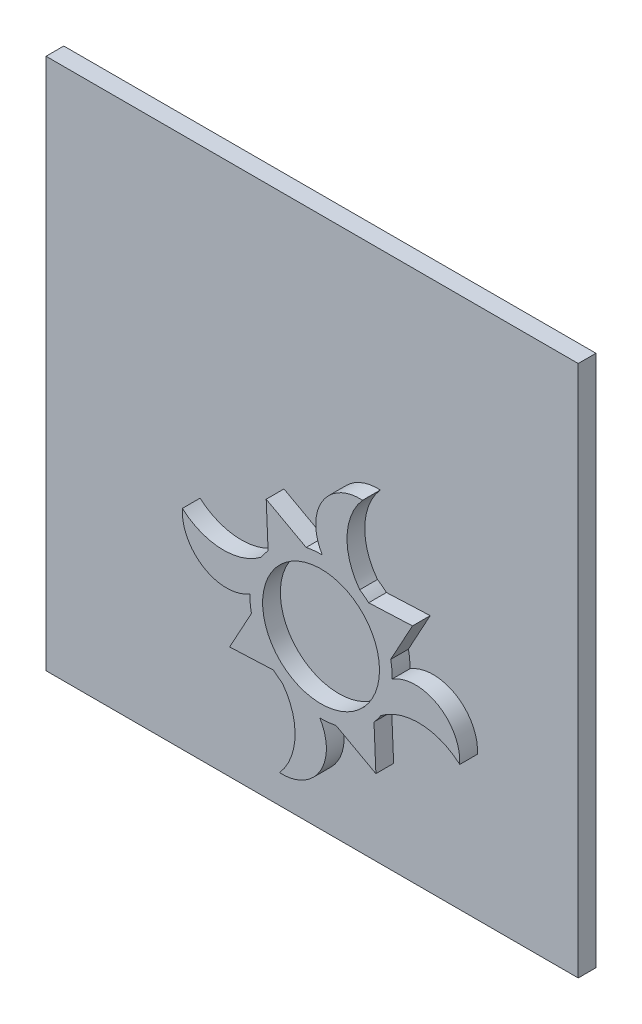
ISO-10303-21;
HEADER;
FILE_DESCRIPTION(('STEP AP214'),'2;1');
FILE_NAME('part.step','',(''),(''),'','','');
FILE_SCHEMA(('AUTOMOTIVE_DESIGN { 1 0 10303 214 1 1 1 1 }'));
ENDSEC;
DATA;
#1=APPLICATION_CONTEXT('core data for automotive mechanical design processes');
#2=APPLICATION_PROTOCOL_DEFINITION('international standard','automotive_design',2000,#1);
#3=PRODUCT_CONTEXT('',#1,'mechanical');
#4=PRODUCT('Part','Part','',(#3));
#5=PRODUCT_RELATED_PRODUCT_CATEGORY('part','',(#4));
#6=PRODUCT_DEFINITION_FORMATION('','',#4);
#7=PRODUCT_DEFINITION_CONTEXT('part definition',#1,'design');
#8=PRODUCT_DEFINITION('design','',#6,#7);
#9=PRODUCT_DEFINITION_SHAPE('','',#8);
#10=(LENGTH_UNIT() NAMED_UNIT(*) SI_UNIT(.MILLI.,.METRE.));
#11=(NAMED_UNIT(*) PLANE_ANGLE_UNIT() SI_UNIT($,.RADIAN.));
#12=(NAMED_UNIT(*) SI_UNIT($,.STERADIAN.) SOLID_ANGLE_UNIT());
#13=UNCERTAINTY_MEASURE_WITH_UNIT(LENGTH_MEASURE(1.E-05),#10,'distance_accuracy_value','');
#14=(GEOMETRIC_REPRESENTATION_CONTEXT(3) GLOBAL_UNCERTAINTY_ASSIGNED_CONTEXT((#13)) GLOBAL_UNIT_ASSIGNED_CONTEXT((#10,
#11,#12)) REPRESENTATION_CONTEXT('',''));
#15=CARTESIAN_POINT('',(0.,0.,0.));
#16=DIRECTION('',(0.,0.,1.));
#17=DIRECTION('',(1.,0.,0.));
#18=AXIS2_PLACEMENT_3D('',#15,#16,#17);
#19=CARTESIAN_POINT('',(0.,0.,10.));
#20=DIRECTION('',(1.,0.,0.));
#21=DIRECTION('',(0.,0.,-1.));
#22=AXIS2_PLACEMENT_3D('',#19,#20,#21);
#23=PLANE('',#22);
#24=DIRECTION('',(0.,-1.,0.));
#25=VECTOR('',#24,1.);
#26=CARTESIAN_POINT('',(0.,0.,0.));
#27=LINE('',#26,#25);
#28=CARTESIAN_POINT('',(0.,300.,0.));
#29=VERTEX_POINT('',#28);
#30=CARTESIAN_POINT('',(0.,0.,0.));
#31=VERTEX_POINT('',#30);
#32=EDGE_CURVE('E255',#29,#31,#27,.T.);
#33=ORIENTED_EDGE('',*,*,#32,.T.);
#34=DIRECTION('',(0.,0.,-1.));
#35=VECTOR('',#34,1.);
#36=CARTESIAN_POINT('',(0.,0.,10.));
#37=LINE('',#36,#35);
#38=CARTESIAN_POINT('',(0.,0.,10.));
#39=VERTEX_POINT('',#38);
#40=EDGE_CURVE('E11',#39,#31,#37,.T.);
#41=ORIENTED_EDGE('',*,*,#40,.F.);
#42=DIRECTION('',(0.,-1.,0.));
#43=VECTOR('',#42,1.);
#44=CARTESIAN_POINT('',(0.,0.,10.));
#45=LINE('',#44,#43);
#46=CARTESIAN_POINT('',(0.,300.,10.));
#47=VERTEX_POINT('',#46);
#48=EDGE_CURVE('E476',#47,#39,#45,.T.);
#49=ORIENTED_EDGE('',*,*,#48,.F.);
#50=DIRECTION('',(0.,0.,-1.));
#51=VECTOR('',#50,1.);
#52=CARTESIAN_POINT('',(0.,300.,10.));
#53=LINE('',#52,#51);
#54=EDGE_CURVE('E490',#47,#29,#53,.T.);
#55=ORIENTED_EDGE('',*,*,#54,.T.);
#56=EDGE_LOOP('',(#33,#41,#49,#55));
#57=FACE_BOUND('',#56,.T.);
#58=ADVANCED_FACE('F47',(#57),#23,.F.);
#59=CARTESIAN_POINT('',(0.,0.,10.));
#60=DIRECTION('',(0.,1.,0.));
#61=DIRECTION('',(0.,0.,1.));
#62=AXIS2_PLACEMENT_3D('',#59,#60,#61);
#63=PLANE('',#62);
#64=DIRECTION('',(1.,0.,0.));
#65=VECTOR('',#64,1.);
#66=CARTESIAN_POINT('',(0.,0.,0.));
#67=LINE('',#66,#65);
#68=CARTESIAN_POINT('',(300.,0.,0.));
#69=VERTEX_POINT('',#68);
#70=EDGE_CURVE('E494',#31,#69,#67,.T.);
#71=ORIENTED_EDGE('',*,*,#70,.T.);
#72=DIRECTION('',(0.,0.,-1.));
#73=VECTOR('',#72,1.);
#74=CARTESIAN_POINT('',(300.,0.,10.));
#75=LINE('',#74,#73);
#76=CARTESIAN_POINT('',(300.,0.,10.));
#77=VERTEX_POINT('',#76);
#78=EDGE_CURVE('E55',#77,#69,#75,.T.);
#79=ORIENTED_EDGE('',*,*,#78,.F.);
#80=DIRECTION('',(1.,0.,0.));
#81=VECTOR('',#80,1.);
#82=CARTESIAN_POINT('',(0.,0.,10.));
#83=LINE('',#82,#81);
#84=EDGE_CURVE('E480',#39,#77,#83,.T.);
#85=ORIENTED_EDGE('',*,*,#84,.F.);
#86=ORIENTED_EDGE('',*,*,#40,.T.);
#87=EDGE_LOOP('',(#71,#79,#85,#86));
#88=FACE_BOUND('',#87,.T.);
#89=ADVANCED_FACE('F532',(#88),#63,.F.);
#90=CARTESIAN_POINT('',(300.,0.,10.));
#91=DIRECTION('',(-1.,0.,0.));
#92=DIRECTION('',(0.,0.,1.));
#93=AXIS2_PLACEMENT_3D('',#90,#91,#92);
#94=PLANE('',#93);
#95=DIRECTION('',(0.,1.,0.));
#96=VECTOR('',#95,1.);
#97=CARTESIAN_POINT('',(300.,0.,0.));
#98=LINE('',#97,#96);
#99=CARTESIAN_POINT('',(300.,300.,0.));
#100=VERTEX_POINT('',#99);
#101=EDGE_CURVE('E497',#69,#100,#98,.T.);
#102=ORIENTED_EDGE('',*,*,#101,.T.);
#103=DIRECTION('',(0.,0.,-1.));
#104=VECTOR('',#103,1.);
#105=CARTESIAN_POINT('',(300.,300.,10.));
#106=LINE('',#105,#104);
#107=CARTESIAN_POINT('',(300.,300.,10.));
#108=VERTEX_POINT('',#107);
#109=EDGE_CURVE('E505',#108,#100,#106,.T.);
#110=ORIENTED_EDGE('',*,*,#109,.F.);
#111=DIRECTION('',(0.,1.,0.));
#112=VECTOR('',#111,1.);
#113=CARTESIAN_POINT('',(300.,0.,10.));
#114=LINE('',#113,#112);
#115=EDGE_CURVE('E484',#77,#108,#114,.T.);
#116=ORIENTED_EDGE('',*,*,#115,.F.);
#117=ORIENTED_EDGE('',*,*,#78,.T.);
#118=EDGE_LOOP('',(#102,#110,#116,#117));
#119=FACE_BOUND('',#118,.T.);
#120=ADVANCED_FACE('F516',(#119),#94,.F.);
#121=CARTESIAN_POINT('',(0.,300.,10.));
#122=DIRECTION('',(0.,-1.,0.));
#123=DIRECTION('',(0.,0.,-1.));
#124=AXIS2_PLACEMENT_3D('',#121,#122,#123);
#125=PLANE('',#124);
#126=DIRECTION('',(-1.,0.,0.));
#127=VECTOR('',#126,1.);
#128=CARTESIAN_POINT('',(0.,300.,0.));
#129=LINE('',#128,#127);
#130=EDGE_CURVE('E481',#100,#29,#129,.T.);
#131=ORIENTED_EDGE('',*,*,#130,.T.);
#132=ORIENTED_EDGE('',*,*,#54,.F.);
#133=DIRECTION('',(-1.,0.,0.));
#134=VECTOR('',#133,1.);
#135=CARTESIAN_POINT('',(0.,300.,10.));
#136=LINE('',#135,#134);
#137=EDGE_CURVE('E487',#108,#47,#136,.T.);
#138=ORIENTED_EDGE('',*,*,#137,.F.);
#139=ORIENTED_EDGE('',*,*,#109,.T.);
#140=EDGE_LOOP('',(#131,#132,#138,#139));
#141=FACE_BOUND('',#140,.T.);
#142=ADVANCED_FACE('F525',(#141),#125,.F.);
#143=CARTESIAN_POINT('',(0.,0.,10.));
#144=DIRECTION('',(0.,0.,-1.));
#145=DIRECTION('',(-1.,0.,0.));
#146=AXIS2_PLACEMENT_3D('',#143,#144,#145);
#147=PLANE('',#146);
#148=CARTESIAN_POINT('',(165.026842842823,104.272964979488,10.));
#149=DIRECTION('',(0.,0.,1.));
#150=DIRECTION('',(1.,0.,0.));
#151=AXIS2_PLACEMENT_3D('',#148,#149,#150);
#152=CIRCLE('',#151,40.1353025420596);
#153=CARTESIAN_POINT('',(205.155931420846,103.566735526846,10.));
#154=VERTEX_POINT('',#153);
#155=CARTESIAN_POINT('',(204.271382857071,112.681804924031,10.));
#156=VERTEX_POINT('',#155);
#157=EDGE_CURVE('E252',#154,#156,#152,.T.);
#158=ORIENTED_EDGE('',*,*,#157,.F.);
#159=CARTESIAN_POINT('',(218.256999590885,82.274436148808,10.));
#160=DIRECTION('',(0.,0.,1.));
#161=DIRECTION('',(1.,0.,0.));
#162=AXIS2_PLACEMENT_3D('',#159,#160,#161);
#163=CIRCLE('',#162,25.);
#164=CARTESIAN_POINT('',(243.217041932001,80.8615361772271,10.));
#165=VERTEX_POINT('',#164);
#166=EDGE_CURVE('E384',#165,#154,#163,.T.);
#167=ORIENTED_EDGE('',*,*,#166,.F.);
#168=CARTESIAN_POINT('',(219.990829610264,54.531850994907,10.));
#169=DIRECTION('',(0.,0.,1.));
#170=DIRECTION('',(1.,0.,0.));
#171=AXIS2_PLACEMENT_3D('',#168,#169,#170);
#172=CIRCLE('',#171,35.1099595644096);
#173=CARTESIAN_POINT('',(198.720776390052,82.4655957604024,10.));
#174=VERTEX_POINT('',#173);
#175=EDGE_CURVE('E381',#165,#174,#172,.T.);
#176=ORIENTED_EDGE('',*,*,#175,.T.);
#177=CARTESIAN_POINT('',(194.874703076955,77.441122896128,10.));
#178=VERTEX_POINT('',#177);
#179=EDGE_CURVE('E331',#178,#174,#152,.T.);
#180=ORIENTED_EDGE('',*,*,#179,.F.);
#181=DIRECTION('',(0.0430538456800749,-0.99907275329285,0.));
#182=VECTOR('',#181,1.);
#183=CARTESIAN_POINT('',(197.844523359955,8.52587316520549,10.));
#184=LINE('',#183,#182);
#185=CARTESIAN_POINT('',(195.939362283946,52.7355016341253,10.));
#186=VERTEX_POINT('',#185);
#187=EDGE_CURVE('E378',#178,#186,#184,.T.);
#188=ORIENTED_EDGE('',*,*,#187,.T.);
#189=DIRECTION('',(-0.877597210520897,0.479398723492189,0.));
#190=VECTOR('',#189,1.);
#191=CARTESIAN_POINT('',(67.2182253100149,123.051072390257,10.));
#192=LINE('',#191,#190);
#193=CARTESIAN_POINT('',(173.435682787369,65.0284249652436,10.));
#194=VERTEX_POINT('',#193);
#195=EDGE_CURVE('E375',#186,#194,#192,.T.);
#196=ORIENTED_EDGE('',*,*,#195,.T.);
#197=CARTESIAN_POINT('',(164.320613390186,64.1438764014638,10.));
#198=VERTEX_POINT('',#197);
#199=EDGE_CURVE('E374',#198,#194,#152,.T.);
#200=ORIENTED_EDGE('',*,*,#199,.F.);
#201=CARTESIAN_POINT('',(143.028314012145,51.0428082314299,10.));
#202=DIRECTION('',(0.,0.,1.));
#203=DIRECTION('',(1.,0.,0.));
#204=AXIS2_PLACEMENT_3D('',#201,#202,#203);
#205=CIRCLE('',#204,25.);
#206=CARTESIAN_POINT('',(141.615414040564,26.0827658903139,10.));
#207=VERTEX_POINT('',#206);
#208=EDGE_CURVE('E370',#207,#198,#205,.T.);
#209=ORIENTED_EDGE('',*,*,#208,.F.);
#210=CARTESIAN_POINT('',(115.285728858244,49.3089782120505,10.));
#211=DIRECTION('',(0.,0.,1.));
#212=DIRECTION('',(1.,0.,0.));
#213=AXIS2_PLACEMENT_3D('',#210,#211,#212);
#214=CIRCLE('',#213,35.1099595644097);
#215=CARTESIAN_POINT('',(143.219473623749,70.5790314322502,10.));
#216=VERTEX_POINT('',#215);
#217=EDGE_CURVE('E367',#207,#216,#214,.T.);
#218=ORIENTED_EDGE('',*,*,#217,.T.);
#219=CARTESIAN_POINT('',(138.195000759462,74.4251047453561,10.));
#220=VERTEX_POINT('',#219);
#221=EDGE_CURVE('E366',#220,#216,#152,.T.);
#222=ORIENTED_EDGE('',*,*,#221,.F.);
#223=DIRECTION('',(-0.99907275329285,-0.043053845680075,0.));
#224=VECTOR('',#223,1.);
#225=CARTESIAN_POINT('',(-2.94515290927659,68.3428385887753,10.));
#226=LINE('',#225,#224);
#227=CARTESIAN_POINT('',(113.489379497463,73.3604455383685,10.));
#228=VERTEX_POINT('',#227);
#229=EDGE_CURVE('E363',#220,#228,#226,.T.);
#230=ORIENTED_EDGE('',*,*,#229,.T.);
#231=DIRECTION('',(0.479398723492189,0.877597210520897,0.));
#232=VECTOR('',#231,1.);
#233=CARTESIAN_POINT('',(56.5427623888985,-30.8872086043562,10.));
#234=LINE('',#233,#232);
#235=CARTESIAN_POINT('',(125.782302828581,95.864125034946,10.));
#236=VERTEX_POINT('',#235);
#237=EDGE_CURVE('E360',#228,#236,#234,.T.);
#238=ORIENTED_EDGE('',*,*,#237,.T.);
#239=CARTESIAN_POINT('',(124.897754264799,104.979194432127,10.));
#240=VERTEX_POINT('',#239);
#241=EDGE_CURVE('E359',#240,#236,#152,.T.);
#242=ORIENTED_EDGE('',*,*,#241,.F.);
#243=CARTESIAN_POINT('',(111.796686094767,126.271493810169,10.));
#244=DIRECTION('',(0.,0.,1.));
#245=DIRECTION('',(1.,0.,0.));
#246=AXIS2_PLACEMENT_3D('',#243,#244,#245);
#247=CIRCLE('',#246,25.);
#248=CARTESIAN_POINT('',(86.8366437536511,127.68439378175,10.));
#249=VERTEX_POINT('',#248);
#250=EDGE_CURVE('E355',#249,#240,#247,.T.);
#251=ORIENTED_EDGE('',*,*,#250,.F.);
#252=CARTESIAN_POINT('',(110.062856075388,154.01407896407,10.));
#253=DIRECTION('',(0.,0.,1.));
#254=DIRECTION('',(1.,0.,0.));
#255=AXIS2_PLACEMENT_3D('',#252,#253,#254);
#256=CIRCLE('',#255,35.1099595644097);
#257=CARTESIAN_POINT('',(131.332909295589,126.080334198567,10.));
#258=VERTEX_POINT('',#257);
#259=EDGE_CURVE('E352',#249,#258,#256,.T.);
#260=ORIENTED_EDGE('',*,*,#259,.T.);
#261=CARTESIAN_POINT('',(135.178982608694,131.104807062852,10.));
#262=VERTEX_POINT('',#261);
#263=EDGE_CURVE('E351',#262,#258,#152,.T.);
#264=ORIENTED_EDGE('',*,*,#263,.F.);
#265=DIRECTION('',(-0.0430538456800749,0.99907275329285,0.));
#266=VECTOR('',#265,1.);
#267=CARTESIAN_POINT('',(140.567742526595,6.05759878286116,10.));
#268=LINE('',#267,#266);
#269=CARTESIAN_POINT('',(134.114323401706,155.810428324852,10.));
#270=VERTEX_POINT('',#269);
#271=EDGE_CURVE('E348',#262,#270,#268,.T.);
#272=ORIENTED_EDGE('',*,*,#271,.T.);
#273=DIRECTION('',(0.877597210520897,-0.47939872349219,0.));
#274=VECTOR('',#273,1.);
#275=CARTESIAN_POINT('',(96.3749792603397,176.426028727758,10.));
#276=LINE('',#275,#274);
#277=CARTESIAN_POINT('',(156.618002898283,143.517504993734,10.));
#278=VERTEX_POINT('',#277);
#279=EDGE_CURVE('E345',#270,#278,#276,.T.);
#280=ORIENTED_EDGE('',*,*,#279,.T.);
#281=CARTESIAN_POINT('',(165.733072295467,144.402053557511,10.));
#282=VERTEX_POINT('',#281);
#283=EDGE_CURVE('E344',#282,#278,#152,.T.);
#284=ORIENTED_EDGE('',*,*,#283,.F.);
#285=CARTESIAN_POINT('',(187.025371673507,157.503121727548,10.));
#286=DIRECTION('',(0.,0.,1.));
#287=DIRECTION('',(1.,0.,0.));
#288=AXIS2_PLACEMENT_3D('',#285,#286,#287);
#289=CIRCLE('',#288,25.);
#290=CARTESIAN_POINT('',(188.438271645088,182.463164068664,10.));
#291=VERTEX_POINT('',#290);
#292=EDGE_CURVE('E340',#291,#282,#289,.T.);
#293=ORIENTED_EDGE('',*,*,#292,.F.);
#294=CARTESIAN_POINT('',(214.767956827408,159.236951746927,10.));
#295=DIRECTION('',(0.,0.,1.));
#296=DIRECTION('',(1.,0.,0.));
#297=AXIS2_PLACEMENT_3D('',#294,#295,#296);
#298=CIRCLE('',#297,35.1099595644097);
#299=CARTESIAN_POINT('',(186.834212061913,137.966898526714,10.));
#300=VERTEX_POINT('',#299);
#301=EDGE_CURVE('E337',#291,#300,#298,.T.);
#302=ORIENTED_EDGE('',*,*,#301,.T.);
#303=CARTESIAN_POINT('',(191.858684926186,134.120825213617,10.));
#304=VERTEX_POINT('',#303);
#305=EDGE_CURVE('E332',#304,#300,#152,.T.);
#306=ORIENTED_EDGE('',*,*,#305,.F.);
#307=DIRECTION('',(0.99907275329285,0.0430538456800749,0.));
#308=VECTOR('',#307,1.);
#309=CARTESIAN_POINT('',(-5.41342729162092,125.619619422135,10.));
#310=LINE('',#309,#308);
#311=CARTESIAN_POINT('',(216.564306188189,135.185484420609,10.));
#312=VERTEX_POINT('',#311);
#313=EDGE_CURVE('E67',#304,#312,#310,.T.);
#314=ORIENTED_EDGE('',*,*,#313,.T.);
#315=DIRECTION('',(-0.479398723492189,-0.877597210520897,0.));
#316=VECTOR('',#315,1.);
#317=CARTESIAN_POINT('',(109.917718726399,-60.043962554681,10.));
#318=LINE('',#317,#316);
#319=EDGE_CURVE('E62',#312,#156,#318,.T.);
#320=ORIENTED_EDGE('',*,*,#319,.T.);
#321=EDGE_LOOP('',(#158,#167,#176,#180,#188,#196,#200,#209,#218,#222,#230,#238,#242,#251,#260,
#264,#272,#280,#284,#293,#302,#306,#314,#320));
#322=FACE_BOUND('',#321,.T.);
#323=ORIENTED_EDGE('',*,*,#48,.T.);
#324=ORIENTED_EDGE('',*,*,#84,.T.);
#325=ORIENTED_EDGE('',*,*,#115,.T.);
#326=ORIENTED_EDGE('',*,*,#137,.T.);
#327=EDGE_LOOP('',(#323,#324,#325,#326));
#328=FACE_BOUND('',#327,.T.);
#329=ADVANCED_FACE('F531',(#322,#328),#147,.F.);
#330=CARTESIAN_POINT('',(0.,0.,0.));
#331=DIRECTION('',(0.,0.,-1.));
#332=DIRECTION('',(-1.,0.,0.));
#333=AXIS2_PLACEMENT_3D('',#330,#331,#332);
#334=PLANE('',#333);
#335=ORIENTED_EDGE('',*,*,#32,.F.);
#336=ORIENTED_EDGE('',*,*,#130,.F.);
#337=ORIENTED_EDGE('',*,*,#101,.F.);
#338=ORIENTED_EDGE('',*,*,#70,.F.);
#339=EDGE_LOOP('',(#335,#336,#337,#338));
#340=FACE_BOUND('',#339,.T.);
#341=ADVANCED_FACE('F522',(#340),#334,.T.);
#342=CARTESIAN_POINT('',(165.026842842823,104.272964979488,20.));
#343=DIRECTION('',(0.,0.,-1.));
#344=DIRECTION('',(-1.,0.,0.));
#345=AXIS2_PLACEMENT_3D('',#342,#343,#344);
#346=CYLINDRICAL_SURFACE('',#345,40.1353025420596);
#347=ORIENTED_EDGE('',*,*,#157,.T.);
#348=DIRECTION('',(0.,0.,-1.));
#349=VECTOR('',#348,1.);
#350=CARTESIAN_POINT('',(204.27138285707,112.681804924031,20.));
#351=LINE('',#350,#349);
#352=CARTESIAN_POINT('',(204.27138285707,112.681804924031,20.));
#353=VERTEX_POINT('',#352);
#354=EDGE_CURVE('E250',#353,#156,#351,.T.);
#355=ORIENTED_EDGE('',*,*,#354,.F.);
#356=CARTESIAN_POINT('',(165.026842842823,104.272964979488,20.));
#357=DIRECTION('',(0.,0.,1.));
#358=DIRECTION('',(1.,0.,0.));
#359=AXIS2_PLACEMENT_3D('',#356,#357,#358);
#360=CIRCLE('',#359,40.1353025420596);
#361=CARTESIAN_POINT('',(205.155931420846,103.566735526846,20.));
#362=VERTEX_POINT('',#361);
#363=EDGE_CURVE('E231',#362,#353,#360,.T.);
#364=ORIENTED_EDGE('',*,*,#363,.F.);
#365=DIRECTION('',(0.,0.,-1.));
#366=VECTOR('',#365,1.);
#367=CARTESIAN_POINT('',(205.155931420846,103.566735526846,20.));
#368=LINE('',#367,#366);
#369=EDGE_CURVE('E324',#362,#154,#368,.T.);
#370=ORIENTED_EDGE('',*,*,#369,.T.);
#371=EDGE_LOOP('',(#347,#355,#364,#370));
#372=FACE_BOUND('',#371,.T.);
#373=ADVANCED_FACE('F251',(#372),#346,.T.);
#374=CARTESIAN_POINT('',(109.917718726399,-60.043962554681,20.));
#375=DIRECTION('',(0.877597210520897,-0.479398723492189,0.));
#376=DIRECTION('',(0.479398723492189,0.877597210520897,0.));
#377=AXIS2_PLACEMENT_3D('',#374,#375,#376);
#378=PLANE('',#377);
#379=ORIENTED_EDGE('',*,*,#319,.F.);
#380=DIRECTION('',(0.,0.,-1.));
#381=VECTOR('',#380,1.);
#382=CARTESIAN_POINT('',(216.564306188189,135.185484420609,20.));
#383=LINE('',#382,#381);
#384=CARTESIAN_POINT('',(216.564306188189,135.185484420609,20.));
#385=VERTEX_POINT('',#384);
#386=EDGE_CURVE('E256',#385,#312,#383,.T.);
#387=ORIENTED_EDGE('',*,*,#386,.F.);
#388=DIRECTION('',(-0.479398723492189,-0.877597210520897,0.));
#389=VECTOR('',#388,1.);
#390=CARTESIAN_POINT('',(109.917718726399,-60.043962554681,20.));
#391=LINE('',#390,#389);
#392=EDGE_CURVE('E236',#385,#353,#391,.T.);
#393=ORIENTED_EDGE('',*,*,#392,.T.);
#394=ORIENTED_EDGE('',*,*,#354,.T.);
#395=EDGE_LOOP('',(#379,#387,#393,#394));
#396=FACE_BOUND('',#395,.T.);
#397=ADVANCED_FACE('F258',(#396),#378,.T.);
#398=CARTESIAN_POINT('',(-5.41342729162092,125.619619422135,20.));
#399=DIRECTION('',(-0.0430538456800749,0.99907275329285,0.));
#400=DIRECTION('',(-0.99907275329285,-0.0430538456800749,0.));
#401=AXIS2_PLACEMENT_3D('',#398,#399,#400);
#402=PLANE('',#401);
#403=ORIENTED_EDGE('',*,*,#313,.F.);
#404=DIRECTION('',(0.,0.,-1.));
#405=VECTOR('',#404,1.);
#406=CARTESIAN_POINT('',(191.858684926188,134.120825213619,20.));
#407=LINE('',#406,#405);
#408=CARTESIAN_POINT('',(191.858684926188,134.120825213619,20.));
#409=VERTEX_POINT('',#408);
#410=EDGE_CURVE('E470',#409,#304,#407,.T.);
#411=ORIENTED_EDGE('',*,*,#410,.F.);
#412=DIRECTION('',(0.99907275329285,0.0430538456800749,0.));
#413=VECTOR('',#412,1.);
#414=CARTESIAN_POINT('',(-5.41342729162092,125.619619422135,20.));
#415=LINE('',#414,#413);
#416=EDGE_CURVE('E260',#409,#385,#415,.T.);
#417=ORIENTED_EDGE('',*,*,#416,.T.);
#418=ORIENTED_EDGE('',*,*,#386,.T.);
#419=EDGE_LOOP('',(#403,#411,#417,#418));
#420=FACE_BOUND('',#419,.T.);
#421=ADVANCED_FACE('F555',(#420),#402,.T.);
#422=ORIENTED_EDGE('',*,*,#305,.T.);
#423=DIRECTION('',(0.,0.,-1.));
#424=VECTOR('',#423,1.);
#425=CARTESIAN_POINT('',(186.834212061913,137.966898526714,20.));
#426=LINE('',#425,#424);
#427=CARTESIAN_POINT('',(186.834212061913,137.966898526714,20.));
#428=VERTEX_POINT('',#427);
#429=EDGE_CURVE('E466',#428,#300,#426,.T.);
#430=ORIENTED_EDGE('',*,*,#429,.F.);
#431=EDGE_CURVE('E248',#409,#428,#360,.T.);
#432=ORIENTED_EDGE('',*,*,#431,.F.);
#433=ORIENTED_EDGE('',*,*,#410,.T.);
#434=EDGE_LOOP('',(#422,#430,#432,#433));
#435=FACE_BOUND('',#434,.T.);
#436=ADVANCED_FACE('F558',(#435),#346,.T.);
#437=CARTESIAN_POINT('',(214.767956827408,159.236951746927,20.));
#438=DIRECTION('',(0.,0.,-1.));
#439=DIRECTION('',(-1.,0.,0.));
#440=AXIS2_PLACEMENT_3D('',#437,#438,#439);
#441=CYLINDRICAL_SURFACE('',#440,35.1099595644097);
#442=ORIENTED_EDGE('',*,*,#301,.F.);
#443=DIRECTION('',(0.,0.,-1.));
#444=VECTOR('',#443,1.);
#445=CARTESIAN_POINT('',(188.438271645088,182.463164068664,20.));
#446=LINE('',#445,#444);
#447=CARTESIAN_POINT('',(188.438271645088,182.463164068664,20.));
#448=VERTEX_POINT('',#447);
#449=EDGE_CURVE('E462',#448,#291,#446,.T.);
#450=ORIENTED_EDGE('',*,*,#449,.F.);
#451=CARTESIAN_POINT('',(214.767956827408,159.236951746927,20.));
#452=DIRECTION('',(0.,0.,1.));
#453=DIRECTION('',(1.,0.,0.));
#454=AXIS2_PLACEMENT_3D('',#451,#452,#453);
#455=CIRCLE('',#454,35.1099595644097);
#456=EDGE_CURVE('E268',#448,#428,#455,.T.);
#457=ORIENTED_EDGE('',*,*,#456,.T.);
#458=ORIENTED_EDGE('',*,*,#429,.T.);
#459=EDGE_LOOP('',(#442,#450,#457,#458));
#460=FACE_BOUND('',#459,.T.);
#461=ADVANCED_FACE('F560',(#460),#441,.F.);
#462=CARTESIAN_POINT('',(187.025371673507,157.503121727548,20.));
#463=DIRECTION('',(0.,0.,-1.));
#464=DIRECTION('',(-1.,0.,0.));
#465=AXIS2_PLACEMENT_3D('',#462,#463,#464);
#466=CYLINDRICAL_SURFACE('',#465,25.);
#467=ORIENTED_EDGE('',*,*,#292,.T.);
#468=DIRECTION('',(0.,0.,-1.));
#469=VECTOR('',#468,1.);
#470=CARTESIAN_POINT('',(165.733072295467,144.402053557511,20.));
#471=LINE('',#470,#469);
#472=CARTESIAN_POINT('',(165.733072295467,144.402053557511,20.));
#473=VERTEX_POINT('',#472);
#474=EDGE_CURVE('E458',#473,#282,#471,.T.);
#475=ORIENTED_EDGE('',*,*,#474,.F.);
#476=CARTESIAN_POINT('',(187.025371673507,157.503121727548,20.));
#477=DIRECTION('',(0.,0.,1.));
#478=DIRECTION('',(1.,0.,0.));
#479=AXIS2_PLACEMENT_3D('',#476,#477,#478);
#480=CIRCLE('',#479,25.);
#481=EDGE_CURVE('E272',#448,#473,#480,.T.);
#482=ORIENTED_EDGE('',*,*,#481,.F.);
#483=ORIENTED_EDGE('',*,*,#449,.T.);
#484=EDGE_LOOP('',(#467,#475,#482,#483));
#485=FACE_BOUND('',#484,.T.);
#486=ADVANCED_FACE('F563',(#485),#466,.T.);
#487=ORIENTED_EDGE('',*,*,#283,.T.);
#488=DIRECTION('',(0.,0.,-1.));
#489=VECTOR('',#488,1.);
#490=CARTESIAN_POINT('',(156.618002898283,143.517504993734,20.));
#491=LINE('',#490,#489);
#492=CARTESIAN_POINT('',(156.618002898283,143.517504993734,20.));
#493=VERTEX_POINT('',#492);
#494=EDGE_CURVE('E454',#493,#278,#491,.T.);
#495=ORIENTED_EDGE('',*,*,#494,.F.);
#496=EDGE_CURVE('E275',#473,#493,#360,.T.);
#497=ORIENTED_EDGE('',*,*,#496,.F.);
#498=ORIENTED_EDGE('',*,*,#474,.T.);
#499=EDGE_LOOP('',(#487,#495,#497,#498));
#500=FACE_BOUND('',#499,.T.);
#501=ADVANCED_FACE('F567',(#500),#346,.T.);
#502=CARTESIAN_POINT('',(96.3749792603397,176.426028727758,20.));
#503=DIRECTION('',(0.47939872349219,0.877597210520897,0.));
#504=DIRECTION('',(-0.877597210520897,0.47939872349219,0.));
#505=AXIS2_PLACEMENT_3D('',#502,#503,#504);
#506=PLANE('',#505);
#507=ORIENTED_EDGE('',*,*,#279,.F.);
#508=DIRECTION('',(0.,0.,-1.));
#509=VECTOR('',#508,1.);
#510=CARTESIAN_POINT('',(134.114323401706,155.810428324852,20.));
#511=LINE('',#510,#509);
#512=CARTESIAN_POINT('',(134.114323401706,155.810428324852,20.));
#513=VERTEX_POINT('',#512);
#514=EDGE_CURVE('E450',#513,#270,#511,.T.);
#515=ORIENTED_EDGE('',*,*,#514,.F.);
#516=DIRECTION('',(0.877597210520897,-0.47939872349219,0.));
#517=VECTOR('',#516,1.);
#518=CARTESIAN_POINT('',(96.3749792603397,176.426028727758,20.));
#519=LINE('',#518,#517);
#520=EDGE_CURVE('E276',#513,#493,#519,.T.);
#521=ORIENTED_EDGE('',*,*,#520,.T.);
#522=ORIENTED_EDGE('',*,*,#494,.T.);
#523=EDGE_LOOP('',(#507,#515,#521,#522));
#524=FACE_BOUND('',#523,.T.);
#525=ADVANCED_FACE('F569',(#524),#506,.T.);
#526=CARTESIAN_POINT('',(140.567742526595,6.05759878286116,20.));
#527=DIRECTION('',(-0.99907275329285,-0.0430538456800749,0.));
#528=DIRECTION('',(0.0430538456800749,-0.99907275329285,0.));
#529=AXIS2_PLACEMENT_3D('',#526,#527,#528);
#530=PLANE('',#529);
#531=ORIENTED_EDGE('',*,*,#271,.F.);
#532=DIRECTION('',(0.,0.,-1.));
#533=VECTOR('',#532,1.);
#534=CARTESIAN_POINT('',(135.178982608694,131.104807062852,20.));
#535=LINE('',#534,#533);
#536=CARTESIAN_POINT('',(135.178982608694,131.104807062852,20.));
#537=VERTEX_POINT('',#536);
#538=EDGE_CURVE('E446',#537,#262,#535,.T.);
#539=ORIENTED_EDGE('',*,*,#538,.F.);
#540=DIRECTION('',(-0.0430538456800749,0.99907275329285,0.));
#541=VECTOR('',#540,1.);
#542=CARTESIAN_POINT('',(140.567742526595,6.05759878286116,20.));
#543=LINE('',#542,#541);
#544=EDGE_CURVE('E280',#537,#513,#543,.T.);
#545=ORIENTED_EDGE('',*,*,#544,.T.);
#546=ORIENTED_EDGE('',*,*,#514,.T.);
#547=EDGE_LOOP('',(#531,#539,#545,#546));
#548=FACE_BOUND('',#547,.T.);
#549=ADVANCED_FACE('F572',(#548),#530,.T.);
#550=ORIENTED_EDGE('',*,*,#263,.T.);
#551=DIRECTION('',(0.,0.,-1.));
#552=VECTOR('',#551,1.);
#553=CARTESIAN_POINT('',(131.332909295589,126.080334198567,20.));
#554=LINE('',#553,#552);
#555=CARTESIAN_POINT('',(131.332909295589,126.080334198567,20.));
#556=VERTEX_POINT('',#555);
#557=EDGE_CURVE('E442',#556,#258,#554,.T.);
#558=ORIENTED_EDGE('',*,*,#557,.F.);
#559=EDGE_CURVE('E284',#537,#556,#360,.T.);
#560=ORIENTED_EDGE('',*,*,#559,.F.);
#561=ORIENTED_EDGE('',*,*,#538,.T.);
#562=EDGE_LOOP('',(#550,#558,#560,#561));
#563=FACE_BOUND('',#562,.T.);
#564=ADVANCED_FACE('F576',(#563),#346,.T.);
#565=CARTESIAN_POINT('',(110.062856075388,154.01407896407,20.));
#566=DIRECTION('',(0.,0.,-1.));
#567=DIRECTION('',(-1.,0.,0.));
#568=AXIS2_PLACEMENT_3D('',#565,#566,#567);
#569=CYLINDRICAL_SURFACE('',#568,35.1099595644097);
#570=ORIENTED_EDGE('',*,*,#259,.F.);
#571=DIRECTION('',(0.,0.,-1.));
#572=VECTOR('',#571,1.);
#573=CARTESIAN_POINT('',(86.8366437536511,127.68439378175,20.));
#574=LINE('',#573,#572);
#575=CARTESIAN_POINT('',(86.8366437536511,127.68439378175,20.));
#576=VERTEX_POINT('',#575);
#577=EDGE_CURVE('E438',#576,#249,#574,.T.);
#578=ORIENTED_EDGE('',*,*,#577,.F.);
#579=CARTESIAN_POINT('',(110.062856075388,154.01407896407,20.));
#580=DIRECTION('',(0.,0.,1.));
#581=DIRECTION('',(1.,0.,0.));
#582=AXIS2_PLACEMENT_3D('',#579,#580,#581);
#583=CIRCLE('',#582,35.1099595644097);
#584=EDGE_CURVE('E285',#576,#556,#583,.T.);
#585=ORIENTED_EDGE('',*,*,#584,.T.);
#586=ORIENTED_EDGE('',*,*,#557,.T.);
#587=EDGE_LOOP('',(#570,#578,#585,#586));
#588=FACE_BOUND('',#587,.T.);
#589=ADVANCED_FACE('F578',(#588),#569,.F.);
#590=CARTESIAN_POINT('',(111.796686094767,126.271493810169,20.));
#591=DIRECTION('',(0.,0.,-1.));
#592=DIRECTION('',(-1.,0.,0.));
#593=AXIS2_PLACEMENT_3D('',#590,#591,#592);
#594=CYLINDRICAL_SURFACE('',#593,25.);
#595=ORIENTED_EDGE('',*,*,#250,.T.);
#596=DIRECTION('',(0.,0.,-1.));
#597=VECTOR('',#596,1.);
#598=CARTESIAN_POINT('',(124.897754264799,104.979194432127,20.));
#599=LINE('',#598,#597);
#600=CARTESIAN_POINT('',(124.897754264799,104.979194432127,20.));
#601=VERTEX_POINT('',#600);
#602=EDGE_CURVE('E434',#601,#240,#599,.T.);
#603=ORIENTED_EDGE('',*,*,#602,.F.);
#604=CARTESIAN_POINT('',(111.796686094767,126.271493810169,20.));
#605=DIRECTION('',(0.,0.,1.));
#606=DIRECTION('',(1.,0.,0.));
#607=AXIS2_PLACEMENT_3D('',#604,#605,#606);
#608=CIRCLE('',#607,25.);
#609=EDGE_CURVE('E289',#576,#601,#608,.T.);
#610=ORIENTED_EDGE('',*,*,#609,.F.);
#611=ORIENTED_EDGE('',*,*,#577,.T.);
#612=EDGE_LOOP('',(#595,#603,#610,#611));
#613=FACE_BOUND('',#612,.T.);
#614=ADVANCED_FACE('F581',(#613),#594,.T.);
#615=ORIENTED_EDGE('',*,*,#241,.T.);
#616=DIRECTION('',(0.,0.,-1.));
#617=VECTOR('',#616,1.);
#618=CARTESIAN_POINT('',(125.782302828579,95.8641250349456,20.));
#619=LINE('',#618,#617);
#620=CARTESIAN_POINT('',(125.782302828579,95.8641250349456,20.));
#621=VERTEX_POINT('',#620);
#622=EDGE_CURVE('E430',#621,#236,#619,.T.);
#623=ORIENTED_EDGE('',*,*,#622,.F.);
#624=EDGE_CURVE('E292',#601,#621,#360,.T.);
#625=ORIENTED_EDGE('',*,*,#624,.F.);
#626=ORIENTED_EDGE('',*,*,#602,.T.);
#627=EDGE_LOOP('',(#615,#623,#625,#626));
#628=FACE_BOUND('',#627,.T.);
#629=ADVANCED_FACE('F585',(#628),#346,.T.);
#630=CARTESIAN_POINT('',(56.5427623888985,-30.8872086043562,20.));
#631=DIRECTION('',(-0.877597210520897,0.479398723492189,0.));
#632=DIRECTION('',(-0.479398723492189,-0.877597210520897,0.));
#633=AXIS2_PLACEMENT_3D('',#630,#631,#632);
#634=PLANE('',#633);
#635=ORIENTED_EDGE('',*,*,#237,.F.);
#636=DIRECTION('',(0.,0.,-1.));
#637=VECTOR('',#636,1.);
#638=CARTESIAN_POINT('',(113.489379497463,73.3604455383685,20.));
#639=LINE('',#638,#637);
#640=CARTESIAN_POINT('',(113.489379497463,73.3604455383685,20.));
#641=VERTEX_POINT('',#640);
#642=EDGE_CURVE('E426',#641,#228,#639,.T.);
#643=ORIENTED_EDGE('',*,*,#642,.F.);
#644=DIRECTION('',(0.479398723492189,0.877597210520897,0.));
#645=VECTOR('',#644,1.);
#646=CARTESIAN_POINT('',(56.5427623888985,-30.8872086043562,20.));
#647=LINE('',#646,#645);
#648=EDGE_CURVE('E293',#641,#621,#647,.T.);
#649=ORIENTED_EDGE('',*,*,#648,.T.);
#650=ORIENTED_EDGE('',*,*,#622,.T.);
#651=EDGE_LOOP('',(#635,#643,#649,#650));
#652=FACE_BOUND('',#651,.T.);
#653=ADVANCED_FACE('F587',(#652),#634,.T.);
#654=CARTESIAN_POINT('',(-2.94515290927659,68.3428385887753,20.));
#655=DIRECTION('',(0.043053845680075,-0.99907275329285,0.));
#656=DIRECTION('',(0.99907275329285,0.043053845680075,0.));
#657=AXIS2_PLACEMENT_3D('',#654,#655,#656);
#658=PLANE('',#657);
#659=ORIENTED_EDGE('',*,*,#229,.F.);
#660=DIRECTION('',(0.,0.,-1.));
#661=VECTOR('',#660,1.);
#662=CARTESIAN_POINT('',(138.195000759462,74.4251047453565,20.));
#663=LINE('',#662,#661);
#664=CARTESIAN_POINT('',(138.195000759462,74.4251047453565,20.));
#665=VERTEX_POINT('',#664);
#666=EDGE_CURVE('E422',#665,#220,#663,.T.);
#667=ORIENTED_EDGE('',*,*,#666,.F.);
#668=DIRECTION('',(-0.99907275329285,-0.043053845680075,0.));
#669=VECTOR('',#668,1.);
#670=CARTESIAN_POINT('',(-2.94515290927659,68.3428385887753,20.));
#671=LINE('',#670,#669);
#672=EDGE_CURVE('E297',#665,#641,#671,.T.);
#673=ORIENTED_EDGE('',*,*,#672,.T.);
#674=ORIENTED_EDGE('',*,*,#642,.T.);
#675=EDGE_LOOP('',(#659,#667,#673,#674));
#676=FACE_BOUND('',#675,.T.);
#677=ADVANCED_FACE('F590',(#676),#658,.T.);
#678=ORIENTED_EDGE('',*,*,#221,.T.);
#679=DIRECTION('',(0.,0.,-1.));
#680=VECTOR('',#679,1.);
#681=CARTESIAN_POINT('',(143.219473623749,70.5790314322502,20.));
#682=LINE('',#681,#680);
#683=CARTESIAN_POINT('',(143.219473623749,70.5790314322502,20.));
#684=VERTEX_POINT('',#683);
#685=EDGE_CURVE('E418',#684,#216,#682,.T.);
#686=ORIENTED_EDGE('',*,*,#685,.F.);
#687=EDGE_CURVE('E301',#665,#684,#360,.T.);
#688=ORIENTED_EDGE('',*,*,#687,.F.);
#689=ORIENTED_EDGE('',*,*,#666,.T.);
#690=EDGE_LOOP('',(#678,#686,#688,#689));
#691=FACE_BOUND('',#690,.T.);
#692=ADVANCED_FACE('F594',(#691),#346,.T.);
#693=CARTESIAN_POINT('',(115.285728858244,49.3089782120505,20.));
#694=DIRECTION('',(0.,0.,-1.));
#695=DIRECTION('',(-1.,0.,0.));
#696=AXIS2_PLACEMENT_3D('',#693,#694,#695);
#697=CYLINDRICAL_SURFACE('',#696,35.1099595644097);
#698=ORIENTED_EDGE('',*,*,#217,.F.);
#699=DIRECTION('',(0.,0.,-1.));
#700=VECTOR('',#699,1.);
#701=CARTESIAN_POINT('',(141.615414040564,26.0827658903138,20.));
#702=LINE('',#701,#700);
#703=CARTESIAN_POINT('',(141.615414040564,26.0827658903138,20.));
#704=VERTEX_POINT('',#703);
#705=EDGE_CURVE('E414',#704,#207,#702,.T.);
#706=ORIENTED_EDGE('',*,*,#705,.F.);
#707=CARTESIAN_POINT('',(115.285728858244,49.3089782120505,20.));
#708=DIRECTION('',(0.,0.,1.));
#709=DIRECTION('',(1.,0.,0.));
#710=AXIS2_PLACEMENT_3D('',#707,#708,#709);
#711=CIRCLE('',#710,35.1099595644097);
#712=EDGE_CURVE('E302',#704,#684,#711,.T.);
#713=ORIENTED_EDGE('',*,*,#712,.T.);
#714=ORIENTED_EDGE('',*,*,#685,.T.);
#715=EDGE_LOOP('',(#698,#706,#713,#714));
#716=FACE_BOUND('',#715,.T.);
#717=ADVANCED_FACE('F596',(#716),#697,.F.);
#718=CARTESIAN_POINT('',(143.028314012145,51.0428082314299,20.));
#719=DIRECTION('',(0.,0.,-1.));
#720=DIRECTION('',(-1.,0.,0.));
#721=AXIS2_PLACEMENT_3D('',#718,#719,#720);
#722=CYLINDRICAL_SURFACE('',#721,25.);
#723=ORIENTED_EDGE('',*,*,#208,.T.);
#724=DIRECTION('',(0.,0.,-1.));
#725=VECTOR('',#724,1.);
#726=CARTESIAN_POINT('',(164.320613390186,64.1438764014638,20.));
#727=LINE('',#726,#725);
#728=CARTESIAN_POINT('',(164.320613390186,64.1438764014638,20.));
#729=VERTEX_POINT('',#728);
#730=EDGE_CURVE('E410',#729,#198,#727,.T.);
#731=ORIENTED_EDGE('',*,*,#730,.F.);
#732=CARTESIAN_POINT('',(143.028314012145,51.0428082314299,20.));
#733=DIRECTION('',(0.,0.,1.));
#734=DIRECTION('',(1.,0.,0.));
#735=AXIS2_PLACEMENT_3D('',#732,#733,#734);
#736=CIRCLE('',#735,25.);
#737=EDGE_CURVE('E306',#704,#729,#736,.T.);
#738=ORIENTED_EDGE('',*,*,#737,.F.);
#739=ORIENTED_EDGE('',*,*,#705,.T.);
#740=EDGE_LOOP('',(#723,#731,#738,#739));
#741=FACE_BOUND('',#740,.T.);
#742=ADVANCED_FACE('F599',(#741),#722,.T.);
#743=ORIENTED_EDGE('',*,*,#199,.T.);
#744=DIRECTION('',(0.,0.,-1.));
#745=VECTOR('',#744,1.);
#746=CARTESIAN_POINT('',(173.435682787369,65.0284249652432,20.));
#747=LINE('',#746,#745);
#748=CARTESIAN_POINT('',(173.435682787369,65.0284249652432,20.));
#749=VERTEX_POINT('',#748);
#750=EDGE_CURVE('E406',#749,#194,#747,.T.);
#751=ORIENTED_EDGE('',*,*,#750,.F.);
#752=EDGE_CURVE('E309',#729,#749,#360,.T.);
#753=ORIENTED_EDGE('',*,*,#752,.F.);
#754=ORIENTED_EDGE('',*,*,#730,.T.);
#755=EDGE_LOOP('',(#743,#751,#753,#754));
#756=FACE_BOUND('',#755,.T.);
#757=ADVANCED_FACE('F603',(#756),#346,.T.);
#758=CARTESIAN_POINT('',(67.2182253100149,123.051072390257,20.));
#759=DIRECTION('',(-0.479398723492189,-0.877597210520897,0.));
#760=DIRECTION('',(0.877597210520897,-0.479398723492189,0.));
#761=AXIS2_PLACEMENT_3D('',#758,#759,#760);
#762=PLANE('',#761);
#763=ORIENTED_EDGE('',*,*,#195,.F.);
#764=DIRECTION('',(0.,0.,-1.));
#765=VECTOR('',#764,1.);
#766=CARTESIAN_POINT('',(195.939362283946,52.7355016341253,20.));
#767=LINE('',#766,#765);
#768=CARTESIAN_POINT('',(195.939362283946,52.7355016341253,20.));
#769=VERTEX_POINT('',#768);
#770=EDGE_CURVE('E402',#769,#186,#767,.T.);
#771=ORIENTED_EDGE('',*,*,#770,.F.);
#772=DIRECTION('',(-0.877597210520897,0.479398723492189,0.));
#773=VECTOR('',#772,1.);
#774=CARTESIAN_POINT('',(67.2182253100149,123.051072390257,20.));
#775=LINE('',#774,#773);
#776=EDGE_CURVE('E310',#769,#749,#775,.T.);
#777=ORIENTED_EDGE('',*,*,#776,.T.);
#778=ORIENTED_EDGE('',*,*,#750,.T.);
#779=EDGE_LOOP('',(#763,#771,#777,#778));
#780=FACE_BOUND('',#779,.T.);
#781=ADVANCED_FACE('F605',(#780),#762,.T.);
#782=CARTESIAN_POINT('',(197.844523359955,8.52587316520549,20.));
#783=DIRECTION('',(0.99907275329285,0.0430538456800749,0.));
#784=DIRECTION('',(-0.0430538456800749,0.99907275329285,0.));
#785=AXIS2_PLACEMENT_3D('',#782,#783,#784);
#786=PLANE('',#785);
#787=ORIENTED_EDGE('',*,*,#187,.F.);
#788=DIRECTION('',(0.,0.,-1.));
#789=VECTOR('',#788,1.);
#790=CARTESIAN_POINT('',(194.874703076956,77.4411228961267,20.));
#791=LINE('',#790,#789);
#792=CARTESIAN_POINT('',(194.874703076956,77.4411228961267,20.));
#793=VERTEX_POINT('',#792);
#794=EDGE_CURVE('E398',#793,#178,#791,.T.);
#795=ORIENTED_EDGE('',*,*,#794,.F.);
#796=DIRECTION('',(0.0430538456800749,-0.99907275329285,0.));
#797=VECTOR('',#796,1.);
#798=CARTESIAN_POINT('',(197.844523359955,8.52587316520549,20.));
#799=LINE('',#798,#797);
#800=EDGE_CURVE('E314',#793,#769,#799,.T.);
#801=ORIENTED_EDGE('',*,*,#800,.T.);
#802=ORIENTED_EDGE('',*,*,#770,.T.);
#803=EDGE_LOOP('',(#787,#795,#801,#802));
#804=FACE_BOUND('',#803,.T.);
#805=ADVANCED_FACE('F608',(#804),#786,.T.);
#806=ORIENTED_EDGE('',*,*,#179,.T.);
#807=DIRECTION('',(0.,0.,-1.));
#808=VECTOR('',#807,1.);
#809=CARTESIAN_POINT('',(198.720776390052,82.4655957604024,20.));
#810=LINE('',#809,#808);
#811=CARTESIAN_POINT('',(198.720776390052,82.4655957604024,20.));
#812=VERTEX_POINT('',#811);
#813=EDGE_CURVE('E394',#812,#174,#810,.T.);
#814=ORIENTED_EDGE('',*,*,#813,.F.);
#815=EDGE_CURVE('E247',#793,#812,#360,.T.);
#816=ORIENTED_EDGE('',*,*,#815,.F.);
#817=ORIENTED_EDGE('',*,*,#794,.T.);
#818=EDGE_LOOP('',(#806,#814,#816,#817));
#819=FACE_BOUND('',#818,.T.);
#820=ADVANCED_FACE('F612',(#819),#346,.T.);
#821=CARTESIAN_POINT('',(219.990829610264,54.531850994907,20.));
#822=DIRECTION('',(0.,0.,-1.));
#823=DIRECTION('',(-1.,0.,0.));
#824=AXIS2_PLACEMENT_3D('',#821,#822,#823);
#825=CYLINDRICAL_SURFACE('',#824,35.1099595644096);
#826=ORIENTED_EDGE('',*,*,#175,.F.);
#827=DIRECTION('',(0.,0.,-1.));
#828=VECTOR('',#827,1.);
#829=CARTESIAN_POINT('',(243.217041932001,80.8615361772271,20.));
#830=LINE('',#829,#828);
#831=CARTESIAN_POINT('',(243.217041932001,80.8615361772271,20.));
#832=VERTEX_POINT('',#831);
#833=EDGE_CURVE('E390',#832,#165,#830,.T.);
#834=ORIENTED_EDGE('',*,*,#833,.F.);
#835=CARTESIAN_POINT('',(219.990829610264,54.531850994907,20.));
#836=DIRECTION('',(0.,0.,1.));
#837=DIRECTION('',(1.,0.,0.));
#838=AXIS2_PLACEMENT_3D('',#835,#836,#837);
#839=CIRCLE('',#838,35.1099595644096);
#840=EDGE_CURVE('E318',#832,#812,#839,.T.);
#841=ORIENTED_EDGE('',*,*,#840,.T.);
#842=ORIENTED_EDGE('',*,*,#813,.T.);
#843=EDGE_LOOP('',(#826,#834,#841,#842));
#844=FACE_BOUND('',#843,.T.);
#845=ADVANCED_FACE('F551',(#844),#825,.F.);
#846=CARTESIAN_POINT('',(165.026842842823,104.272964979488,20.));
#847=DIRECTION('',(0.,0.,-1.));
#848=DIRECTION('',(-1.,0.,0.));
#849=AXIS2_PLACEMENT_3D('',#846,#847,#848);
#850=CYLINDRICAL_SURFACE('',#849,32.9412001843591);
#851=CARTESIAN_POINT('',(165.026842842823,104.272964979488,20.));
#852=DIRECTION('',(0.,0.,1.));
#853=DIRECTION('',(1.,0.,0.));
#854=AXIS2_PLACEMENT_3D('',#851,#852,#853);
#855=CIRCLE('',#854,32.9412001843591);
#856=CARTESIAN_POINT('',(197.968043027182,104.272964979488,20.));
#857=VERTEX_POINT('',#856);
#858=EDGE_CURVE('E245',#857,#857,#855,.T.);
#859=ORIENTED_EDGE('',*,*,#858,.T.);
#860=EDGE_LOOP('',(#859));
#861=FACE_BOUND('',#860,.T.);
#862=CARTESIAN_POINT('',(165.026842842823,104.272964979488,10.));
#863=DIRECTION('',(0.,0.,1.));
#864=DIRECTION('',(1.,0.,0.));
#865=AXIS2_PLACEMENT_3D('',#862,#863,#864);
#866=CIRCLE('',#865,32.9412001843591);
#867=CARTESIAN_POINT('',(197.968043027182,104.272964979488,10.));
#868=VERTEX_POINT('',#867);
#869=EDGE_CURVE('E325',#868,#868,#866,.T.);
#870=ORIENTED_EDGE('',*,*,#869,.F.);
#871=EDGE_LOOP('',(#870));
#872=FACE_BOUND('',#871,.T.);
#873=ADVANCED_FACE('F547',(#861,#872),#850,.F.);
#874=CARTESIAN_POINT('',(218.256999590885,82.274436148808,20.));
#875=DIRECTION('',(0.,0.,-1.));
#876=DIRECTION('',(-1.,0.,0.));
#877=AXIS2_PLACEMENT_3D('',#874,#875,#876);
#878=CYLINDRICAL_SURFACE('',#877,25.);
#879=ORIENTED_EDGE('',*,*,#166,.T.);
#880=ORIENTED_EDGE('',*,*,#369,.F.);
#881=CARTESIAN_POINT('',(218.256999590885,82.274436148808,20.));
#882=DIRECTION('',(0.,0.,1.));
#883=DIRECTION('',(1.,0.,0.));
#884=AXIS2_PLACEMENT_3D('',#881,#882,#883);
#885=CIRCLE('',#884,25.);
#886=EDGE_CURVE('E240',#832,#362,#885,.T.);
#887=ORIENTED_EDGE('',*,*,#886,.F.);
#888=ORIENTED_EDGE('',*,*,#833,.T.);
#889=EDGE_LOOP('',(#879,#880,#887,#888));
#890=FACE_BOUND('',#889,.T.);
#891=ADVANCED_FACE('F550',(#890),#878,.T.);
#892=CARTESIAN_POINT('',(0.,0.,20.));
#893=DIRECTION('',(0.,0.,1.));
#894=DIRECTION('',(1.,0.,0.));
#895=AXIS2_PLACEMENT_3D('',#892,#893,#894);
#896=PLANE('',#895);
#897=ORIENTED_EDGE('',*,*,#858,.F.);
#898=EDGE_LOOP('',(#897));
#899=FACE_BOUND('',#898,.T.);
#900=ORIENTED_EDGE('',*,*,#363,.T.);
#901=ORIENTED_EDGE('',*,*,#392,.F.);
#902=ORIENTED_EDGE('',*,*,#416,.F.);
#903=ORIENTED_EDGE('',*,*,#431,.T.);
#904=ORIENTED_EDGE('',*,*,#456,.F.);
#905=ORIENTED_EDGE('',*,*,#481,.T.);
#906=ORIENTED_EDGE('',*,*,#496,.T.);
#907=ORIENTED_EDGE('',*,*,#520,.F.);
#908=ORIENTED_EDGE('',*,*,#544,.F.);
#909=ORIENTED_EDGE('',*,*,#559,.T.);
#910=ORIENTED_EDGE('',*,*,#584,.F.);
#911=ORIENTED_EDGE('',*,*,#609,.T.);
#912=ORIENTED_EDGE('',*,*,#624,.T.);
#913=ORIENTED_EDGE('',*,*,#648,.F.);
#914=ORIENTED_EDGE('',*,*,#672,.F.);
#915=ORIENTED_EDGE('',*,*,#687,.T.);
#916=ORIENTED_EDGE('',*,*,#712,.F.);
#917=ORIENTED_EDGE('',*,*,#737,.T.);
#918=ORIENTED_EDGE('',*,*,#752,.T.);
#919=ORIENTED_EDGE('',*,*,#776,.F.);
#920=ORIENTED_EDGE('',*,*,#800,.F.);
#921=ORIENTED_EDGE('',*,*,#815,.T.);
#922=ORIENTED_EDGE('',*,*,#840,.F.);
#923=ORIENTED_EDGE('',*,*,#886,.T.);
#924=EDGE_LOOP('',(#900,#901,#902,#903,#904,#905,#906,#907,#908,#909,#910,#911,#912,#913,#914,
#915,#916,#917,#918,#919,#920,#921,#922,#923));
#925=FACE_BOUND('',#924,.T.);
#926=ADVANCED_FACE('F233',(#899,#925),#896,.T.);
#927=ORIENTED_EDGE('',*,*,#869,.T.);
#928=EDGE_LOOP('',(#927));
#929=FACE_BOUND('',#928,.T.);
#930=ADVANCED_FACE('F546',(#929),#147,.F.);
#931=CLOSED_SHELL('',(#58,#89,#120,#142,#329,#341,#373,#397,#421,#436,#461,#486,#501,#525,#549,
#564,#589,#614,#629,#653,#677,#692,#717,#742,#757,#781,#805,#820,#845,#873,#891,#926,#930));
#932=MANIFOLD_SOLID_BREP('B2',#931);
#933=ADVANCED_BREP_SHAPE_REPRESENTATION('',(#18,#932),#14);
#934=SHAPE_DEFINITION_REPRESENTATION(#9,#933);
ENDSEC;
END-ISO-10303-21;
